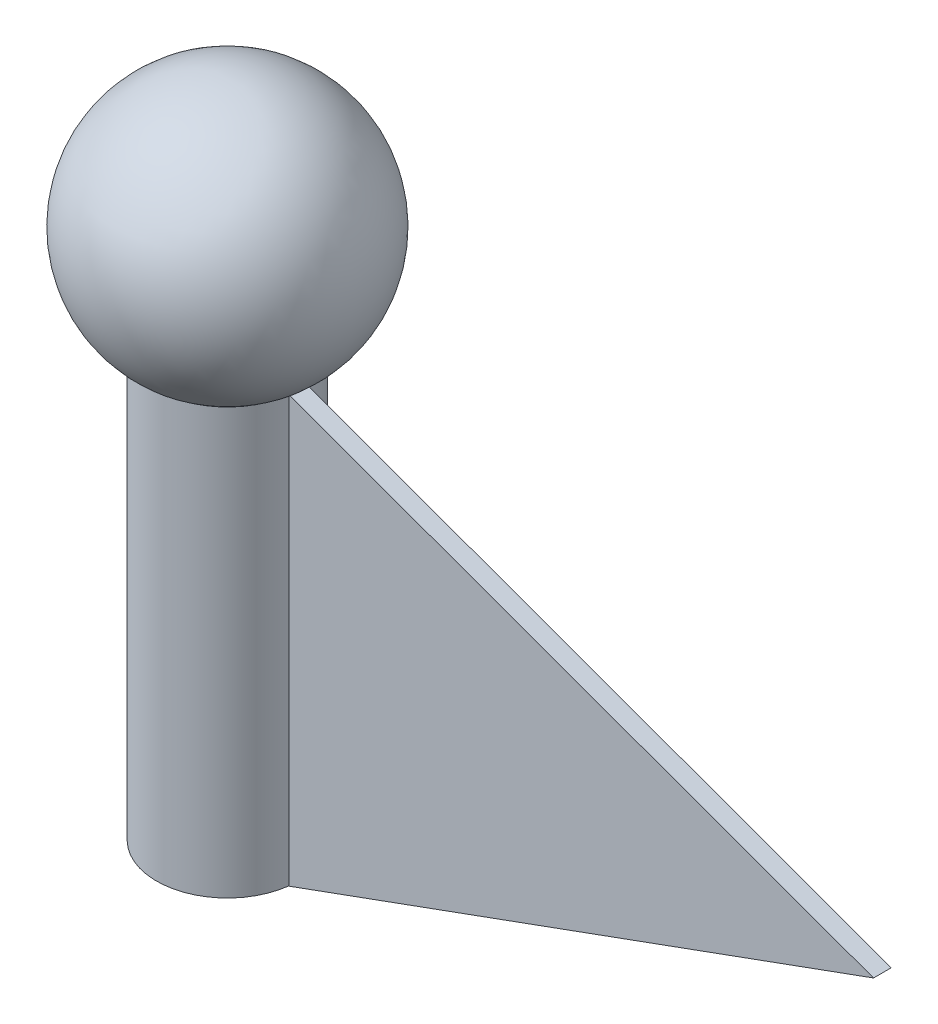
ISO-10303-21;
HEADER;
FILE_DESCRIPTION(('STEP AP214'),'2;1');
FILE_NAME('part.step','',(''),(''),'','','');
FILE_SCHEMA(('AUTOMOTIVE_DESIGN { 1 0 10303 214 1 1 1 1 }'));
ENDSEC;
DATA;
#1=APPLICATION_CONTEXT('core data for automotive mechanical design processes');
#2=APPLICATION_PROTOCOL_DEFINITION('international standard','automotive_design',2000,#1);
#3=PRODUCT_CONTEXT('',#1,'mechanical');
#4=PRODUCT('Part','Part','',(#3));
#5=PRODUCT_RELATED_PRODUCT_CATEGORY('part','',(#4));
#6=PRODUCT_DEFINITION_FORMATION('','',#4);
#7=PRODUCT_DEFINITION_CONTEXT('part definition',#1,'design');
#8=PRODUCT_DEFINITION('design','',#6,#7);
#9=PRODUCT_DEFINITION_SHAPE('','',#8);
#10=(LENGTH_UNIT() NAMED_UNIT(*) SI_UNIT(.MILLI.,.METRE.));
#11=(NAMED_UNIT(*) PLANE_ANGLE_UNIT() SI_UNIT($,.RADIAN.));
#12=(NAMED_UNIT(*) SI_UNIT($,.STERADIAN.) SOLID_ANGLE_UNIT());
#13=UNCERTAINTY_MEASURE_WITH_UNIT(LENGTH_MEASURE(1.E-05),#10,'distance_accuracy_value','');
#14=(GEOMETRIC_REPRESENTATION_CONTEXT(3) GLOBAL_UNCERTAINTY_ASSIGNED_CONTEXT((#13)) GLOBAL_UNIT_ASSIGNED_CONTEXT((#10,
#11,#12)) REPRESENTATION_CONTEXT('',''));
#15=CARTESIAN_POINT('',(0.,0.,0.));
#16=DIRECTION('',(0.,0.,1.));
#17=DIRECTION('',(1.,0.,0.));
#18=AXIS2_PLACEMENT_3D('',#15,#16,#17);
#19=CARTESIAN_POINT('',(0.,152.4,0.));
#20=DIRECTION('',(0.,-1.,0.));
#21=DIRECTION('',(0.,0.,-1.));
#22=AXIS2_PLACEMENT_3D('',#19,#20,#21);
#23=CYLINDRICAL_SURFACE('',#22,25.4);
#24=CARTESIAN_POINT('',(0.,0.,0.));
#25=DIRECTION('',(0.,1.,0.));
#26=DIRECTION('',(0.,0.,1.));
#27=AXIS2_PLACEMENT_3D('',#24,#25,#26);
#28=CIRCLE('',#27,25.4);
#29=CARTESIAN_POINT('',(25.2007812378902,1.11022302462516E-13,-3.175));
#30=VERTEX_POINT('',#29);
#31=CARTESIAN_POINT('',(25.2007812378902,1.11022302462516E-13,3.175));
#32=VERTEX_POINT('',#31);
#33=EDGE_CURVE('E54',#30,#32,#28,.T.);
#34=ORIENTED_EDGE('',*,*,#33,.T.);
#35=DIRECTION('',(0.,-1.,0.));
#36=VECTOR('',#35,1.);
#37=CARTESIAN_POINT('',(25.2007812378902,152.4,3.175));
#38=LINE('',#37,#36);
#39=CARTESIAN_POINT('',(25.2007812378902,152.4,3.175));
#40=VERTEX_POINT('',#39);
#41=EDGE_CURVE('E110',#32,#40,#38,.F.);
#42=ORIENTED_EDGE('',*,*,#41,.T.);
#43=CARTESIAN_POINT('',(0.,152.4,0.));
#44=DIRECTION('',(0.,1.,0.));
#45=DIRECTION('',(0.,0.,1.));
#46=AXIS2_PLACEMENT_3D('',#43,#44,#45);
#47=CIRCLE('',#46,25.4);
#48=CARTESIAN_POINT('',(25.2007812378902,152.4,-3.175));
#49=VERTEX_POINT('',#48);
#50=EDGE_CURVE('E60',#49,#40,#47,.T.);
#51=ORIENTED_EDGE('',*,*,#50,.F.);
#52=DIRECTION('',(0.,-1.,0.));
#53=VECTOR('',#52,1.);
#54=CARTESIAN_POINT('',(25.2007812378902,152.4,-3.175));
#55=LINE('',#54,#53);
#56=EDGE_CURVE('E124',#30,#49,#55,.F.);
#57=ORIENTED_EDGE('',*,*,#56,.F.);
#58=EDGE_LOOP('',(#34,#42,#51,#57));
#59=FACE_BOUND('',#58,.T.);
#60=ADVANCED_FACE('F51',(#59),#23,.T.);
#61=CARTESIAN_POINT('',(0.,0.,0.));
#62=DIRECTION('',(0.,1.,0.));
#63=DIRECTION('',(0.,0.,1.));
#64=AXIS2_PLACEMENT_3D('',#61,#62,#63);
#65=PLANE('',#64);
#66=DIRECTION('',(1.,0.,0.));
#67=VECTOR('',#66,1.);
#68=CARTESIAN_POINT('',(20.4927401434839,1.11022302462516E-13,-3.175));
#69=LINE('',#68,#67);
#70=CARTESIAN_POINT('',(25.4,1.11022302462516E-13,-3.175));
#71=VERTEX_POINT('',#70);
#72=EDGE_CURVE('E120',#30,#71,#69,.T.);
#73=ORIENTED_EDGE('',*,*,#72,.T.);
#74=DIRECTION('',(0.,0.,-1.));
#75=VECTOR('',#74,1.);
#76=CARTESIAN_POINT('',(25.4,1.11022302462516E-13,3.175));
#77=LINE('',#76,#75);
#78=CARTESIAN_POINT('',(25.4,1.11022302462516E-13,3.175));
#79=VERTEX_POINT('',#78);
#80=EDGE_CURVE('E117',#79,#71,#77,.T.);
#81=ORIENTED_EDGE('',*,*,#80,.F.);
#82=DIRECTION('',(1.,0.,0.));
#83=VECTOR('',#82,1.);
#84=CARTESIAN_POINT('',(20.4927401434839,1.11022302462516E-13,3.175));
#85=LINE('',#84,#83);
#86=EDGE_CURVE('E101',#32,#79,#85,.T.);
#87=ORIENTED_EDGE('',*,*,#86,.F.);
#88=ORIENTED_EDGE('',*,*,#33,.F.);
#89=EDGE_LOOP('',(#73,#81,#87,#88));
#90=FACE_BOUND('',#89,.T.);
#91=CARTESIAN_POINT('',(0.,0.,0.));
#92=DIRECTION('',(0.,-1.,0.));
#93=DIRECTION('',(0.,0.,-1.));
#94=AXIS2_PLACEMENT_3D('',#91,#92,#93);
#95=CIRCLE('',#94,15.7298898);
#96=CARTESIAN_POINT('',(0.,0.,-15.7298898));
#97=VERTEX_POINT('',#96);
#98=EDGE_CURVE('E148',#97,#97,#95,.T.);
#99=ORIENTED_EDGE('',*,*,#98,.F.);
#100=EDGE_LOOP('',(#99));
#101=FACE_BOUND('',#100,.T.);
#102=ADVANCED_FACE('F118',(#90,#101),#65,.F.);
#103=CARTESIAN_POINT('',(0.,50.8,0.));
#104=DIRECTION('',(0.,-1.,0.));
#105=DIRECTION('',(0.,0.,-1.));
#106=AXIS2_PLACEMENT_3D('',#103,#104,#105);
#107=CONICAL_SURFACE('',#106,14.4907,1.02974425867665);
#108=CARTESIAN_POINT('',(0.,59.5068909721427,0.));
#109=VERTEX_POINT('',#108);
#110=VERTEX_LOOP('',#109);
#111=FACE_BOUND('',#110,.T.);
#112=CARTESIAN_POINT('',(0.,50.8,0.));
#113=DIRECTION('',(0.,-1.,0.));
#114=DIRECTION('',(0.,0.,-1.));
#115=AXIS2_PLACEMENT_3D('',#112,#113,#114);
#116=CIRCLE('',#115,14.4907);
#117=CARTESIAN_POINT('',(0.,50.8,-14.4907));
#118=VERTEX_POINT('',#117);
#119=EDGE_CURVE('E157',#118,#118,#116,.T.);
#120=ORIENTED_EDGE('',*,*,#119,.T.);
#121=EDGE_LOOP('',(#120));
#122=FACE_BOUND('',#121,.T.);
#123=ADVANCED_FACE('F182',(#111,#122),#107,.F.);
#124=CARTESIAN_POINT('',(0.,0.,0.));
#125=DIRECTION('',(0.,-1.,0.));
#126=DIRECTION('',(0.,0.,-1.));
#127=AXIS2_PLACEMENT_3D('',#124,#125,#126);
#128=CYLINDRICAL_SURFACE('',#127,14.4907);
#129=ORIENTED_EDGE('',*,*,#119,.F.);
#130=EDGE_LOOP('',(#129));
#131=FACE_BOUND('',#130,.T.);
#132=CARTESIAN_POINT('',(0.,16.764,0.));
#133=DIRECTION('',(0.,-1.,0.));
#134=DIRECTION('',(0.,0.,-1.));
#135=AXIS2_PLACEMENT_3D('',#132,#133,#134);
#136=CIRCLE('',#135,14.4907);
#137=CARTESIAN_POINT('',(0.,16.764,-14.4907));
#138=VERTEX_POINT('',#137);
#139=EDGE_CURVE('E154',#138,#138,#136,.T.);
#140=ORIENTED_EDGE('',*,*,#139,.T.);
#141=EDGE_LOOP('',(#140));
#142=FACE_BOUND('',#141,.T.);
#143=ADVANCED_FACE('F187',(#131,#142),#128,.F.);
#144=CARTESIAN_POINT('',(14.4907,16.764,0.));
#145=DIRECTION('',(0.,1.,0.));
#146=DIRECTION('',(0.,0.,1.));
#147=AXIS2_PLACEMENT_3D('',#144,#145,#146);
#148=PLANE('',#147);
#149=ORIENTED_EDGE('',*,*,#139,.F.);
#150=EDGE_LOOP('',(#149));
#151=FACE_BOUND('',#150,.T.);
#152=CARTESIAN_POINT('',(0.,16.764,0.));
#153=DIRECTION('',(0.,-1.,0.));
#154=DIRECTION('',(0.,0.,-1.));
#155=AXIS2_PLACEMENT_3D('',#152,#153,#154);
#156=CIRCLE('',#155,15.2065304336402);
#157=CARTESIAN_POINT('',(0.,16.764,-15.2065304336402));
#158=VERTEX_POINT('',#157);
#159=EDGE_CURVE('E151',#158,#158,#156,.T.);
#160=ORIENTED_EDGE('',*,*,#159,.T.);
#161=EDGE_LOOP('',(#160));
#162=FACE_BOUND('',#161,.T.);
#163=ADVANCED_FACE('F192',(#151,#162),#148,.F.);
#164=CARTESIAN_POINT('',(0.,0.,0.));
#165=DIRECTION('',(0.,-1.,0.));
#166=DIRECTION('',(0.,0.,-1.));
#167=AXIS2_PLACEMENT_3D('',#164,#165,#166);
#168=CONICAL_SURFACE('',#167,15.7298898,0.0312091050195368);
#169=ORIENTED_EDGE('',*,*,#159,.F.);
#170=EDGE_LOOP('',(#169));
#171=FACE_BOUND('',#170,.T.);
#172=ORIENTED_EDGE('',*,*,#98,.T.);
#173=EDGE_LOOP('',(#172));
#174=FACE_BOUND('',#173,.T.);
#175=ADVANCED_FACE('F196',(#171,#174),#168,.F.);
#176=CARTESIAN_POINT('',(0.,190.5,0.));
#177=DIRECTION('',(0.,-1.,0.));
#178=DIRECTION('',(1.,0.,0.));
#179=AXIS2_PLACEMENT_3D('',#176,#177,#178);
#180=SPHERICAL_SURFACE('',#179,45.7905011983927);
#181=CARTESIAN_POINT('',(25.4,152.4,0.));
#182=VERTEX_POINT('',#181);
#183=EDGE_CURVE('E11',#40,#182,#47,.T.);
#184=ORIENTED_EDGE('',*,*,#183,.T.);
#185=EDGE_CURVE('E59',#182,#49,#47,.T.);
#186=ORIENTED_EDGE('',*,*,#185,.T.);
#187=ORIENTED_EDGE('',*,*,#50,.T.);
#188=EDGE_LOOP('',(#184,#186,#187));
#189=FACE_BOUND('',#188,.T.);
#190=ADVANCED_FACE('F167',(#189),#180,.T.);
#191=CARTESIAN_POINT('',(25.4,152.4,3.175));
#192=DIRECTION('',(0.,-1.,0.));
#193=DIRECTION('',(0.,0.,-1.));
#194=AXIS2_PLACEMENT_3D('',#191,#192,#193);
#195=PLANE('',#194);
#196=ORIENTED_EDGE('',*,*,#183,.F.);
#197=DIRECTION('',(-1.,0.,0.));
#198=VECTOR('',#197,1.);
#199=CARTESIAN_POINT('',(25.4,152.4,3.175));
#200=LINE('',#199,#198);
#201=CARTESIAN_POINT('',(25.4,152.4,3.175));
#202=VERTEX_POINT('',#201);
#203=EDGE_CURVE('E114',#202,#40,#200,.T.);
#204=ORIENTED_EDGE('',*,*,#203,.F.);
#205=DIRECTION('',(0.,0.,-1.));
#206=VECTOR('',#205,1.);
#207=CARTESIAN_POINT('',(25.4,152.4,3.175));
#208=LINE('',#207,#206);
#209=EDGE_CURVE('E142',#202,#182,#208,.T.);
#210=ORIENTED_EDGE('',*,*,#209,.T.);
#211=EDGE_LOOP('',(#196,#204,#210));
#212=FACE_BOUND('',#211,.T.);
#213=ADVANCED_FACE('F175',(#212),#195,.F.);
#214=CARTESIAN_POINT('',(0.,0.,3.175));
#215=DIRECTION('',(0.,0.,1.));
#216=DIRECTION('',(1.,0.,0.));
#217=AXIS2_PLACEMENT_3D('',#214,#215,#216);
#218=PLANE('',#217);
#219=ORIENTED_EDGE('',*,*,#41,.F.);
#220=ORIENTED_EDGE('',*,*,#86,.T.);
#221=DIRECTION('',(0.939692620785907,0.342020143325672,0.));
#222=VECTOR('',#221,1.);
#223=CARTESIAN_POINT('',(25.4,1.11022302462516E-13,3.175));
#224=LINE('',#223,#222);
#225=CARTESIAN_POINT('',(234.757779362439,76.2,3.175));
#226=VERTEX_POINT('',#225);
#227=EDGE_CURVE('E106',#79,#226,#224,.T.);
#228=ORIENTED_EDGE('',*,*,#227,.T.);
#229=DIRECTION('',(0.939692620785907,-0.342020143325673,0.));
#230=VECTOR('',#229,1.);
#231=CARTESIAN_POINT('',(25.4,152.4,3.175));
#232=LINE('',#231,#230);
#233=EDGE_CURVE('E129',#202,#226,#232,.T.);
#234=ORIENTED_EDGE('',*,*,#233,.F.);
#235=ORIENTED_EDGE('',*,*,#203,.T.);
#236=EDGE_LOOP('',(#219,#220,#228,#234,#235));
#237=FACE_BOUND('',#236,.T.);
#238=ADVANCED_FACE('F103',(#237),#218,.T.);
#239=CARTESIAN_POINT('',(0.,0.,-3.175));
#240=DIRECTION('',(0.,0.,1.));
#241=DIRECTION('',(1.,0.,0.));
#242=AXIS2_PLACEMENT_3D('',#239,#240,#241);
#243=PLANE('',#242);
#244=ORIENTED_EDGE('',*,*,#72,.F.);
#245=ORIENTED_EDGE('',*,*,#56,.T.);
#246=DIRECTION('',(-1.,0.,0.));
#247=VECTOR('',#246,1.);
#248=CARTESIAN_POINT('',(25.4,152.4,-3.175));
#249=LINE('',#248,#247);
#250=CARTESIAN_POINT('',(25.4,152.4,-3.175));
#251=VERTEX_POINT('',#250);
#252=EDGE_CURVE('E67',#251,#49,#249,.T.);
#253=ORIENTED_EDGE('',*,*,#252,.F.);
#254=DIRECTION('',(0.939692620785907,-0.342020143325673,0.));
#255=VECTOR('',#254,1.);
#256=CARTESIAN_POINT('',(25.4,152.4,-3.175));
#257=LINE('',#256,#255);
#258=CARTESIAN_POINT('',(234.757779362439,76.2,-3.175));
#259=VERTEX_POINT('',#258);
#260=EDGE_CURVE('E139',#251,#259,#257,.T.);
#261=ORIENTED_EDGE('',*,*,#260,.T.);
#262=DIRECTION('',(0.939692620785907,0.342020143325672,0.));
#263=VECTOR('',#262,1.);
#264=CARTESIAN_POINT('',(25.4,1.11022302462516E-13,-3.175));
#265=LINE('',#264,#263);
#266=EDGE_CURVE('E137',#71,#259,#265,.T.);
#267=ORIENTED_EDGE('',*,*,#266,.F.);
#268=EDGE_LOOP('',(#244,#245,#253,#261,#267));
#269=FACE_BOUND('',#268,.T.);
#270=ADVANCED_FACE('F177',(#269),#243,.F.);
#271=ORIENTED_EDGE('',*,*,#185,.F.);
#272=EDGE_CURVE('E131',#182,#251,#208,.T.);
#273=ORIENTED_EDGE('',*,*,#272,.T.);
#274=ORIENTED_EDGE('',*,*,#252,.T.);
#275=EDGE_LOOP('',(#271,#273,#274));
#276=FACE_BOUND('',#275,.T.);
#277=ADVANCED_FACE('F169',(#276),#195,.F.);
#278=CARTESIAN_POINT('',(25.4,1.11022302462516E-13,3.175));
#279=DIRECTION('',(-0.342020143325672,0.939692620785907,0.));
#280=DIRECTION('',(-0.939692620785907,-0.342020143325672,0.));
#281=AXIS2_PLACEMENT_3D('',#278,#279,#280);
#282=PLANE('',#281);
#283=ORIENTED_EDGE('',*,*,#266,.T.);
#284=DIRECTION('',(0.,0.,-1.));
#285=VECTOR('',#284,1.);
#286=CARTESIAN_POINT('',(234.757779362439,76.2,3.175));
#287=LINE('',#286,#285);
#288=EDGE_CURVE('E125',#226,#259,#287,.T.);
#289=ORIENTED_EDGE('',*,*,#288,.F.);
#290=ORIENTED_EDGE('',*,*,#227,.F.);
#291=ORIENTED_EDGE('',*,*,#80,.T.);
#292=EDGE_LOOP('',(#283,#289,#290,#291));
#293=FACE_BOUND('',#292,.T.);
#294=ADVANCED_FACE('F127',(#293),#282,.F.);
#295=CARTESIAN_POINT('',(25.4,152.4,3.175));
#296=DIRECTION('',(0.342020143325673,0.939692620785907,0.));
#297=DIRECTION('',(-0.939692620785907,0.342020143325673,0.));
#298=AXIS2_PLACEMENT_3D('',#295,#296,#297);
#299=PLANE('',#298);
#300=ORIENTED_EDGE('',*,*,#260,.F.);
#301=ORIENTED_EDGE('',*,*,#272,.F.);
#302=ORIENTED_EDGE('',*,*,#209,.F.);
#303=ORIENTED_EDGE('',*,*,#233,.T.);
#304=ORIENTED_EDGE('',*,*,#288,.T.);
#305=EDGE_LOOP('',(#300,#301,#302,#303,#304));
#306=FACE_BOUND('',#305,.T.);
#307=ADVANCED_FACE('F172',(#306),#299,.T.);
#308=CLOSED_SHELL('',(#60,#102,#123,#143,#163,#175,#190,#213,#238,#270,#277,#294,#307));
#309=MANIFOLD_SOLID_BREP('B2',#308);
#310=ADVANCED_BREP_SHAPE_REPRESENTATION('',(#18,#309),#14);
#311=SHAPE_DEFINITION_REPRESENTATION(#9,#310);
ENDSEC;
END-ISO-10303-21;
